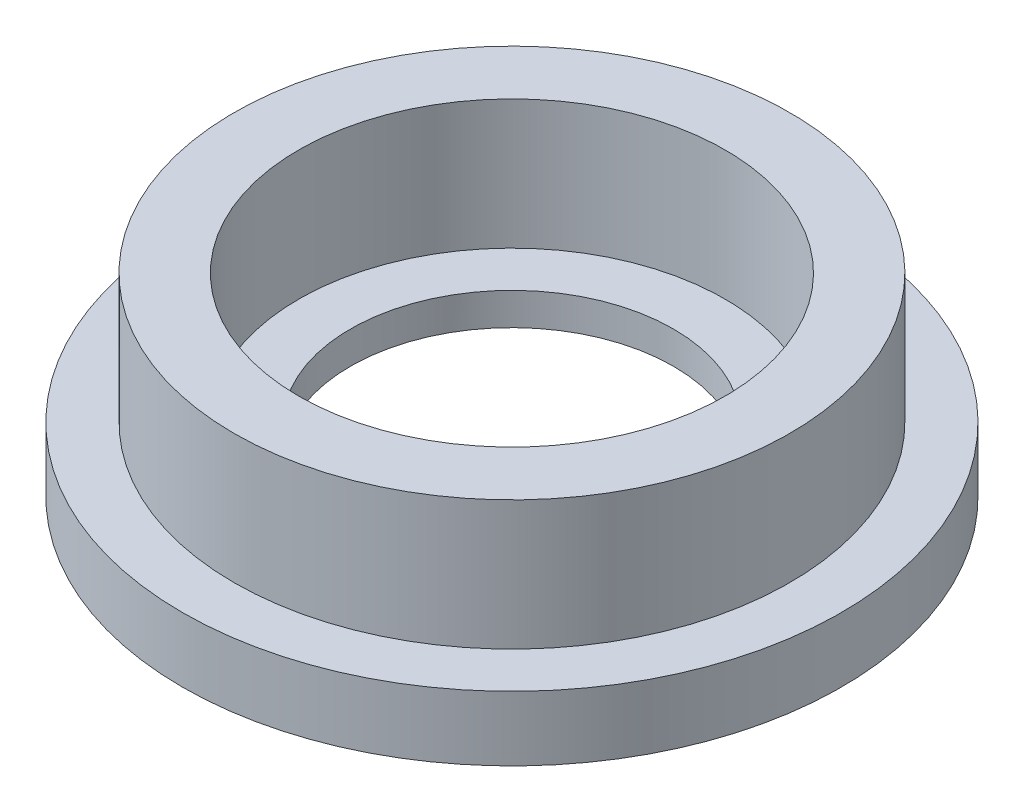
ISO-10303-21;
HEADER;
FILE_DESCRIPTION(('STEP AP214'),'2;1');
FILE_NAME('part.step','',(''),(''),'','','');
FILE_SCHEMA(('AUTOMOTIVE_DESIGN { 1 0 10303 214 1 1 1 1 }'));
ENDSEC;
DATA;
#1=APPLICATION_CONTEXT('core data for automotive mechanical design processes');
#2=APPLICATION_PROTOCOL_DEFINITION('international standard','automotive_design',2000,#1);
#3=PRODUCT_CONTEXT('',#1,'mechanical');
#4=PRODUCT('Part','Part','',(#3));
#5=PRODUCT_RELATED_PRODUCT_CATEGORY('part','',(#4));
#6=PRODUCT_DEFINITION_FORMATION('','',#4);
#7=PRODUCT_DEFINITION_CONTEXT('part definition',#1,'design');
#8=PRODUCT_DEFINITION('design','',#6,#7);
#9=PRODUCT_DEFINITION_SHAPE('','',#8);
#10=(LENGTH_UNIT() NAMED_UNIT(*) SI_UNIT(.MILLI.,.METRE.));
#11=(NAMED_UNIT(*) PLANE_ANGLE_UNIT() SI_UNIT($,.RADIAN.));
#12=(NAMED_UNIT(*) SI_UNIT($,.STERADIAN.) SOLID_ANGLE_UNIT());
#13=UNCERTAINTY_MEASURE_WITH_UNIT(LENGTH_MEASURE(1.E-05),#10,'distance_accuracy_value','');
#14=(GEOMETRIC_REPRESENTATION_CONTEXT(3) GLOBAL_UNCERTAINTY_ASSIGNED_CONTEXT((#13)) GLOBAL_UNIT_ASSIGNED_CONTEXT((#10,
#11,#12)) REPRESENTATION_CONTEXT('',''));
#15=CARTESIAN_POINT('',(0.,0.,0.));
#16=DIRECTION('',(0.,0.,1.));
#17=DIRECTION('',(1.,0.,0.));
#18=AXIS2_PLACEMENT_3D('',#15,#16,#17);
#19=CARTESIAN_POINT('',(0.,2.,0.));
#20=DIRECTION('',(0.,-1.,0.));
#21=DIRECTION('',(0.,0.,-1.));
#22=AXIS2_PLACEMENT_3D('',#19,#20,#21);
#23=CYLINDRICAL_SURFACE('',#22,2.5);
#24=CARTESIAN_POINT('',(0.,1.,0.));
#25=DIRECTION('',(0.,1.,0.));
#26=DIRECTION('',(0.,0.,1.));
#27=AXIS2_PLACEMENT_3D('',#24,#25,#26);
#28=CIRCLE('',#27,2.5);
#29=CARTESIAN_POINT('',(0.,1.,2.5));
#30=VERTEX_POINT('',#29);
#31=EDGE_CURVE('E61',#30,#30,#28,.T.);
#32=ORIENTED_EDGE('',*,*,#31,.T.);
#33=EDGE_LOOP('',(#32));
#34=FACE_BOUND('',#33,.T.);
#35=CARTESIAN_POINT('',(0.,0.5,0.));
#36=DIRECTION('',(0.,-1.,0.));
#37=DIRECTION('',(0.,0.,-1.));
#38=AXIS2_PLACEMENT_3D('',#35,#36,#37);
#39=CIRCLE('',#38,2.5);
#40=CARTESIAN_POINT('',(0.,0.5,-2.5));
#41=VERTEX_POINT('',#40);
#42=EDGE_CURVE('E47',#41,#41,#39,.F.);
#43=ORIENTED_EDGE('',*,*,#42,.F.);
#44=EDGE_LOOP('',(#43));
#45=FACE_BOUND('',#44,.T.);
#46=ADVANCED_FACE('F43',(#34,#45),#23,.F.);
#47=CARTESIAN_POINT('',(0.,1.,0.));
#48=DIRECTION('',(0.,-1.,0.));
#49=DIRECTION('',(0.,0.,-1.));
#50=AXIS2_PLACEMENT_3D('',#47,#48,#49);
#51=CYLINDRICAL_SURFACE('',#50,5.1);
#52=CARTESIAN_POINT('',(0.,1.,0.));
#53=DIRECTION('',(0.,1.,0.));
#54=DIRECTION('',(0.,0.,1.));
#55=AXIS2_PLACEMENT_3D('',#52,#53,#54);
#56=CIRCLE('',#55,5.1);
#57=CARTESIAN_POINT('',(0.,1.,5.1));
#58=VERTEX_POINT('',#57);
#59=EDGE_CURVE('E52',#58,#58,#56,.T.);
#60=ORIENTED_EDGE('',*,*,#59,.F.);
#61=EDGE_LOOP('',(#60));
#62=FACE_BOUND('',#61,.T.);
#63=CARTESIAN_POINT('',(0.,0.,0.));
#64=DIRECTION('',(0.,1.,0.));
#65=DIRECTION('',(0.,0.,1.));
#66=AXIS2_PLACEMENT_3D('',#63,#64,#65);
#67=CIRCLE('',#66,5.1);
#68=CARTESIAN_POINT('',(0.,0.,5.1));
#69=VERTEX_POINT('',#68);
#70=EDGE_CURVE('E58',#69,#69,#67,.T.);
#71=ORIENTED_EDGE('',*,*,#70,.T.);
#72=EDGE_LOOP('',(#71));
#73=FACE_BOUND('',#72,.T.);
#74=ADVANCED_FACE('F45',(#62,#73),#51,.T.);
#75=CARTESIAN_POINT('',(0.,1.,0.));
#76=DIRECTION('',(0.,1.,0.));
#77=DIRECTION('',(0.,0.,1.));
#78=AXIS2_PLACEMENT_3D('',#75,#76,#77);
#79=PLANE('',#78);
#80=CARTESIAN_POINT('',(0.,1.,0.));
#81=DIRECTION('',(0.,1.,0.));
#82=DIRECTION('',(0.,0.,1.));
#83=AXIS2_PLACEMENT_3D('',#80,#81,#82);
#84=CIRCLE('',#83,4.3);
#85=CARTESIAN_POINT('',(0.,1.,4.3));
#86=VERTEX_POINT('',#85);
#87=EDGE_CURVE('E70',#86,#86,#84,.T.);
#88=ORIENTED_EDGE('',*,*,#87,.F.);
#89=EDGE_LOOP('',(#88));
#90=FACE_BOUND('',#89,.T.);
#91=ORIENTED_EDGE('',*,*,#59,.T.);
#92=EDGE_LOOP('',(#91));
#93=FACE_BOUND('',#92,.T.);
#94=ADVANCED_FACE('F96',(#90,#93),#79,.T.);
#95=CARTESIAN_POINT('',(0.,0.,0.));
#96=DIRECTION('',(0.,1.,0.));
#97=DIRECTION('',(0.,0.,1.));
#98=AXIS2_PLACEMENT_3D('',#95,#96,#97);
#99=PLANE('',#98);
#100=CARTESIAN_POINT('',(0.,0.,0.));
#101=DIRECTION('',(0.,-1.,0.));
#102=DIRECTION('',(0.,0.,-1.));
#103=AXIS2_PLACEMENT_3D('',#100,#101,#102);
#104=CIRCLE('',#103,4.5);
#105=CARTESIAN_POINT('',(0.,0.,-4.5));
#106=VERTEX_POINT('',#105);
#107=EDGE_CURVE('E78',#106,#106,#104,.T.);
#108=ORIENTED_EDGE('',*,*,#107,.F.);
#109=EDGE_LOOP('',(#108));
#110=FACE_BOUND('',#109,.T.);
#111=ORIENTED_EDGE('',*,*,#70,.F.);
#112=EDGE_LOOP('',(#111));
#113=FACE_BOUND('',#112,.T.);
#114=ADVANCED_FACE('F99',(#110,#113),#99,.F.);
#115=CARTESIAN_POINT('',(0.,3.,0.));
#116=DIRECTION('',(0.,1.,0.));
#117=DIRECTION('',(0.,0.,1.));
#118=AXIS2_PLACEMENT_3D('',#115,#116,#117);
#119=PLANE('',#118);
#120=CARTESIAN_POINT('',(0.,3.,0.));
#121=DIRECTION('',(0.,1.,0.));
#122=DIRECTION('',(0.,0.,1.));
#123=AXIS2_PLACEMENT_3D('',#120,#121,#122);
#124=CIRCLE('',#123,4.3);
#125=CARTESIAN_POINT('',(0.,3.,4.3));
#126=VERTEX_POINT('',#125);
#127=EDGE_CURVE('E86',#126,#126,#124,.T.);
#128=ORIENTED_EDGE('',*,*,#127,.T.);
#129=EDGE_LOOP('',(#128));
#130=FACE_BOUND('',#129,.T.);
#131=CARTESIAN_POINT('',(0.,3.,0.));
#132=DIRECTION('',(0.,1.,0.));
#133=DIRECTION('',(0.,0.,1.));
#134=AXIS2_PLACEMENT_3D('',#131,#132,#133);
#135=CIRCLE('',#134,3.3);
#136=CARTESIAN_POINT('',(0.,3.,3.3));
#137=VERTEX_POINT('',#136);
#138=EDGE_CURVE('E64',#137,#137,#135,.T.);
#139=ORIENTED_EDGE('',*,*,#138,.F.);
#140=EDGE_LOOP('',(#139));
#141=FACE_BOUND('',#140,.T.);
#142=ADVANCED_FACE('F111',(#130,#141),#119,.T.);
#143=CARTESIAN_POINT('',(0.,3.,0.));
#144=DIRECTION('',(0.,-1.,0.));
#145=DIRECTION('',(0.,0.,-1.));
#146=AXIS2_PLACEMENT_3D('',#143,#144,#145);
#147=CYLINDRICAL_SURFACE('',#146,4.3);
#148=ORIENTED_EDGE('',*,*,#127,.F.);
#149=EDGE_LOOP('',(#148));
#150=FACE_BOUND('',#149,.T.);
#151=ORIENTED_EDGE('',*,*,#87,.T.);
#152=EDGE_LOOP('',(#151));
#153=FACE_BOUND('',#152,.T.);
#154=ADVANCED_FACE('F94',(#150,#153),#147,.T.);
#155=CARTESIAN_POINT('',(0.,3.,0.));
#156=DIRECTION('',(0.,-1.,0.));
#157=DIRECTION('',(0.,0.,-1.));
#158=AXIS2_PLACEMENT_3D('',#155,#156,#157);
#159=CYLINDRICAL_SURFACE('',#158,3.3);
#160=ORIENTED_EDGE('',*,*,#138,.T.);
#161=EDGE_LOOP('',(#160));
#162=FACE_BOUND('',#161,.T.);
#163=CARTESIAN_POINT('',(0.,1.,0.));
#164=DIRECTION('',(0.,1.,0.));
#165=DIRECTION('',(0.,0.,1.));
#166=AXIS2_PLACEMENT_3D('',#163,#164,#165);
#167=CIRCLE('',#166,3.3);
#168=CARTESIAN_POINT('',(0.,1.,3.3));
#169=VERTEX_POINT('',#168);
#170=EDGE_CURVE('E10',#169,#169,#167,.F.);
#171=ORIENTED_EDGE('',*,*,#170,.T.);
#172=EDGE_LOOP('',(#171));
#173=FACE_BOUND('',#172,.T.);
#174=ADVANCED_FACE('F130',(#162,#173),#159,.F.);
#175=ORIENTED_EDGE('',*,*,#31,.F.);
#176=EDGE_LOOP('',(#175));
#177=FACE_BOUND('',#176,.T.);
#178=ORIENTED_EDGE('',*,*,#170,.F.);
#179=EDGE_LOOP('',(#178));
#180=FACE_BOUND('',#179,.T.);
#181=ADVANCED_FACE('F101',(#177,#180),#79,.T.);
#182=CARTESIAN_POINT('',(0.,0.5,0.));
#183=DIRECTION('',(0.,-1.,0.));
#184=DIRECTION('',(0.,0.,-1.));
#185=AXIS2_PLACEMENT_3D('',#182,#183,#184);
#186=PLANE('',#185);
#187=CARTESIAN_POINT('',(0.,0.5,0.));
#188=DIRECTION('',(0.,-1.,0.));
#189=DIRECTION('',(0.,0.,-1.));
#190=AXIS2_PLACEMENT_3D('',#187,#188,#189);
#191=CIRCLE('',#190,4.5);
#192=CARTESIAN_POINT('',(0.,0.5,-4.5));
#193=VERTEX_POINT('',#192);
#194=EDGE_CURVE('E73',#193,#193,#191,.T.);
#195=ORIENTED_EDGE('',*,*,#194,.T.);
#196=EDGE_LOOP('',(#195));
#197=FACE_BOUND('',#196,.T.);
#198=ORIENTED_EDGE('',*,*,#42,.T.);
#199=EDGE_LOOP('',(#198));
#200=FACE_BOUND('',#199,.T.);
#201=ADVANCED_FACE('F154',(#197,#200),#186,.T.);
#202=CARTESIAN_POINT('',(0.,0.5,0.));
#203=DIRECTION('',(0.,-1.,0.));
#204=DIRECTION('',(0.,0.,-1.));
#205=AXIS2_PLACEMENT_3D('',#202,#203,#204);
#206=CYLINDRICAL_SURFACE('',#205,4.5);
#207=ORIENTED_EDGE('',*,*,#194,.F.);
#208=EDGE_LOOP('',(#207));
#209=FACE_BOUND('',#208,.T.);
#210=ORIENTED_EDGE('',*,*,#107,.T.);
#211=EDGE_LOOP('',(#210));
#212=FACE_BOUND('',#211,.T.);
#213=ADVANCED_FACE('F128',(#209,#212),#206,.F.);
#214=CLOSED_SHELL('',(#46,#74,#94,#114,#142,#154,#174,#181,#201,#213));
#215=MANIFOLD_SOLID_BREP('B2',#214);
#216=ADVANCED_BREP_SHAPE_REPRESENTATION('',(#18,#215),#14);
#217=SHAPE_DEFINITION_REPRESENTATION(#9,#216);
ENDSEC;
END-ISO-10303-21;
